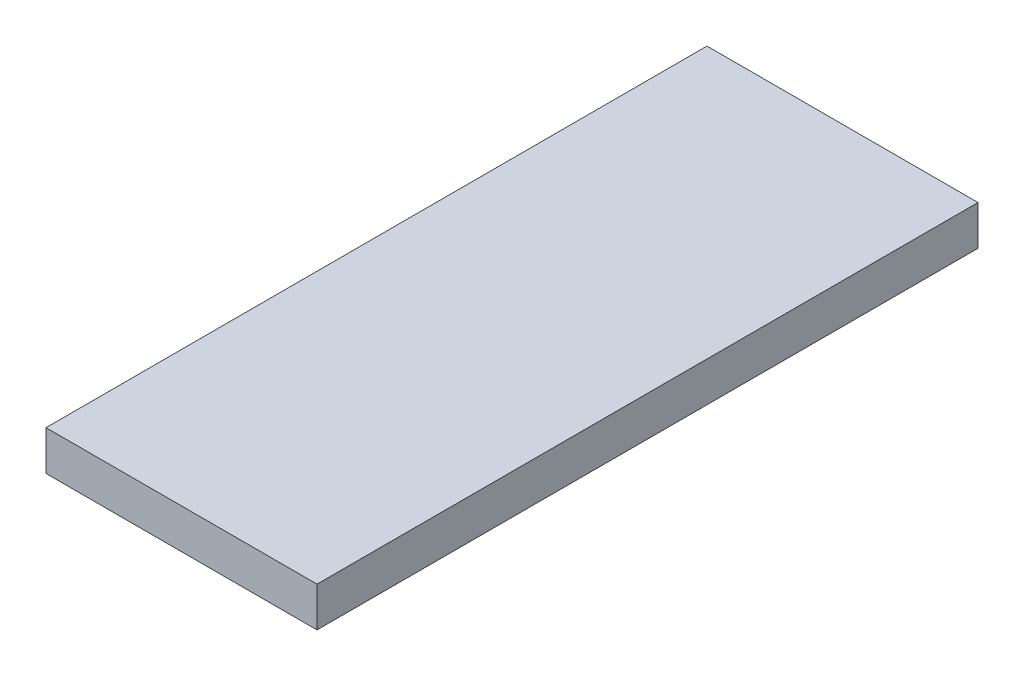
ISO-10303-21;
HEADER;
FILE_DESCRIPTION(('STEP AP214'),'2;1');
FILE_NAME('part.step','',(''),(''),'','','');
FILE_SCHEMA(('AUTOMOTIVE_DESIGN { 1 0 10303 214 1 1 1 1 }'));
ENDSEC;
DATA;
#1=APPLICATION_CONTEXT('core data for automotive mechanical design processes');
#2=APPLICATION_PROTOCOL_DEFINITION('international standard','automotive_design',2000,#1);
#3=PRODUCT_CONTEXT('',#1,'mechanical');
#4=PRODUCT('Part','Part','',(#3));
#5=PRODUCT_RELATED_PRODUCT_CATEGORY('part','',(#4));
#6=PRODUCT_DEFINITION_FORMATION('','',#4);
#7=PRODUCT_DEFINITION_CONTEXT('part definition',#1,'design');
#8=PRODUCT_DEFINITION('design','',#6,#7);
#9=PRODUCT_DEFINITION_SHAPE('','',#8);
#10=(LENGTH_UNIT() NAMED_UNIT(*) SI_UNIT(.MILLI.,.METRE.));
#11=(NAMED_UNIT(*) PLANE_ANGLE_UNIT() SI_UNIT($,.RADIAN.));
#12=(NAMED_UNIT(*) SI_UNIT($,.STERADIAN.) SOLID_ANGLE_UNIT());
#13=UNCERTAINTY_MEASURE_WITH_UNIT(LENGTH_MEASURE(1.E-05),#10,'distance_accuracy_value','');
#14=(GEOMETRIC_REPRESENTATION_CONTEXT(3) GLOBAL_UNCERTAINTY_ASSIGNED_CONTEXT((#13)) GLOBAL_UNIT_ASSIGNED_CONTEXT((#10,
#11,#12)) REPRESENTATION_CONTEXT('',''));
#15=CARTESIAN_POINT('',(0.,0.,0.));
#16=DIRECTION('',(0.,0.,1.));
#17=DIRECTION('',(1.,0.,0.));
#18=AXIS2_PLACEMENT_3D('',#15,#16,#17);
#19=CARTESIAN_POINT('',(-4.1,-0.600000000000001,20.));
#20=DIRECTION('',(1.,0.,0.));
#21=DIRECTION('',(0.,0.,-1.));
#22=AXIS2_PLACEMENT_3D('',#19,#20,#21);
#23=PLANE('',#22);
#24=DIRECTION('',(0.,-1.,0.));
#25=VECTOR('',#24,1.);
#26=CARTESIAN_POINT('',(-4.1,-0.600000000000001,0.));
#27=LINE('',#26,#25);
#28=CARTESIAN_POINT('',(-4.1,0.599999999999999,0.));
#29=VERTEX_POINT('',#28);
#30=CARTESIAN_POINT('',(-4.1,-0.600000000000001,0.));
#31=VERTEX_POINT('',#30);
#32=EDGE_CURVE('E95',#29,#31,#27,.T.);
#33=ORIENTED_EDGE('',*,*,#32,.T.);
#34=DIRECTION('',(0.,0.,-1.));
#35=VECTOR('',#34,1.);
#36=CARTESIAN_POINT('',(-4.1,-0.600000000000001,20.));
#37=LINE('',#36,#35);
#38=CARTESIAN_POINT('',(-4.1,-0.600000000000001,20.));
#39=VERTEX_POINT('',#38);
#40=EDGE_CURVE('E11',#39,#31,#37,.T.);
#41=ORIENTED_EDGE('',*,*,#40,.F.);
#42=DIRECTION('',(0.,-1.,0.));
#43=VECTOR('',#42,1.);
#44=CARTESIAN_POINT('',(-4.1,-0.600000000000001,20.));
#45=LINE('',#44,#43);
#46=CARTESIAN_POINT('',(-4.1,0.599999999999999,20.));
#47=VERTEX_POINT('',#46);
#48=EDGE_CURVE('E83',#47,#39,#45,.T.);
#49=ORIENTED_EDGE('',*,*,#48,.F.);
#50=DIRECTION('',(0.,0.,-1.));
#51=VECTOR('',#50,1.);
#52=CARTESIAN_POINT('',(-4.1,0.599999999999999,20.));
#53=LINE('',#52,#51);
#54=EDGE_CURVE('E91',#47,#29,#53,.T.);
#55=ORIENTED_EDGE('',*,*,#54,.T.);
#56=EDGE_LOOP('',(#33,#41,#49,#55));
#57=FACE_BOUND('',#56,.T.);
#58=ADVANCED_FACE('F32',(#57),#23,.F.);
#59=CARTESIAN_POINT('',(4.1,-0.599999999999999,20.));
#60=DIRECTION('',(0.,1.,0.));
#61=DIRECTION('',(-1.,0.,0.));
#62=AXIS2_PLACEMENT_3D('',#59,#60,#61);
#63=PLANE('',#62);
#64=DIRECTION('',(1.,0.,0.));
#65=VECTOR('',#64,1.);
#66=CARTESIAN_POINT('',(4.1,-0.599999999999999,0.));
#67=LINE('',#66,#65);
#68=CARTESIAN_POINT('',(4.1,-0.599999999999999,0.));
#69=VERTEX_POINT('',#68);
#70=EDGE_CURVE('E87',#31,#69,#67,.T.);
#71=ORIENTED_EDGE('',*,*,#70,.T.);
#72=DIRECTION('',(0.,0.,-1.));
#73=VECTOR('',#72,1.);
#74=CARTESIAN_POINT('',(4.1,-0.599999999999999,20.));
#75=LINE('',#74,#73);
#76=CARTESIAN_POINT('',(4.1,-0.599999999999999,20.));
#77=VERTEX_POINT('',#76);
#78=EDGE_CURVE('E40',#77,#69,#75,.T.);
#79=ORIENTED_EDGE('',*,*,#78,.F.);
#80=DIRECTION('',(1.,0.,0.));
#81=VECTOR('',#80,1.);
#82=CARTESIAN_POINT('',(4.1,-0.599999999999999,20.));
#83=LINE('',#82,#81);
#84=EDGE_CURVE('E78',#39,#77,#83,.T.);
#85=ORIENTED_EDGE('',*,*,#84,.F.);
#86=ORIENTED_EDGE('',*,*,#40,.T.);
#87=EDGE_LOOP('',(#71,#79,#85,#86));
#88=FACE_BOUND('',#87,.T.);
#89=ADVANCED_FACE('F86',(#88),#63,.F.);
#90=CARTESIAN_POINT('',(4.1,-0.599999999999999,20.));
#91=DIRECTION('',(-1.,0.,0.));
#92=DIRECTION('',(0.,0.,1.));
#93=AXIS2_PLACEMENT_3D('',#90,#91,#92);
#94=PLANE('',#93);
#95=DIRECTION('',(0.,1.,0.));
#96=VECTOR('',#95,1.);
#97=CARTESIAN_POINT('',(4.1,-0.599999999999999,0.));
#98=LINE('',#97,#96);
#99=CARTESIAN_POINT('',(4.1,0.6,0.));
#100=VERTEX_POINT('',#99);
#101=EDGE_CURVE('E65',#69,#100,#98,.T.);
#102=ORIENTED_EDGE('',*,*,#101,.T.);
#103=DIRECTION('',(0.,0.,-1.));
#104=VECTOR('',#103,1.);
#105=CARTESIAN_POINT('',(4.1,0.6,20.));
#106=LINE('',#105,#104);
#107=CARTESIAN_POINT('',(4.1,0.6,20.));
#108=VERTEX_POINT('',#107);
#109=EDGE_CURVE('E88',#108,#100,#106,.T.);
#110=ORIENTED_EDGE('',*,*,#109,.F.);
#111=DIRECTION('',(0.,1.,0.));
#112=VECTOR('',#111,1.);
#113=CARTESIAN_POINT('',(4.1,-0.599999999999999,20.));
#114=LINE('',#113,#112);
#115=EDGE_CURVE('E81',#77,#108,#114,.T.);
#116=ORIENTED_EDGE('',*,*,#115,.F.);
#117=ORIENTED_EDGE('',*,*,#78,.T.);
#118=EDGE_LOOP('',(#102,#110,#116,#117));
#119=FACE_BOUND('',#118,.T.);
#120=ADVANCED_FACE('F89',(#119),#94,.F.);
#121=CARTESIAN_POINT('',(4.1,0.6,20.));
#122=DIRECTION('',(0.,-1.,0.));
#123=DIRECTION('',(1.,0.,0.));
#124=AXIS2_PLACEMENT_3D('',#121,#122,#123);
#125=PLANE('',#124);
#126=DIRECTION('',(-1.,0.,0.));
#127=VECTOR('',#126,1.);
#128=CARTESIAN_POINT('',(4.1,0.6,0.));
#129=LINE('',#128,#127);
#130=EDGE_CURVE('E71',#100,#29,#129,.T.);
#131=ORIENTED_EDGE('',*,*,#130,.T.);
#132=ORIENTED_EDGE('',*,*,#54,.F.);
#133=DIRECTION('',(-1.,0.,0.));
#134=VECTOR('',#133,1.);
#135=CARTESIAN_POINT('',(4.1,0.6,20.));
#136=LINE('',#135,#134);
#137=EDGE_CURVE('E48',#108,#47,#136,.T.);
#138=ORIENTED_EDGE('',*,*,#137,.F.);
#139=ORIENTED_EDGE('',*,*,#109,.T.);
#140=EDGE_LOOP('',(#131,#132,#138,#139));
#141=FACE_BOUND('',#140,.T.);
#142=ADVANCED_FACE('F102',(#141),#125,.F.);
#143=CARTESIAN_POINT('',(0.,0.,20.));
#144=DIRECTION('',(0.,0.,1.));
#145=DIRECTION('',(1.,0.,0.));
#146=AXIS2_PLACEMENT_3D('',#143,#144,#145);
#147=PLANE('',#146);
#148=ORIENTED_EDGE('',*,*,#48,.T.);
#149=ORIENTED_EDGE('',*,*,#84,.T.);
#150=ORIENTED_EDGE('',*,*,#115,.T.);
#151=ORIENTED_EDGE('',*,*,#137,.T.);
#152=EDGE_LOOP('',(#148,#149,#150,#151));
#153=FACE_BOUND('',#152,.T.);
#154=ADVANCED_FACE('F79',(#153),#147,.T.);
#155=CARTESIAN_POINT('',(0.,0.,0.));
#156=DIRECTION('',(0.,0.,1.));
#157=DIRECTION('',(1.,0.,0.));
#158=AXIS2_PLACEMENT_3D('',#155,#156,#157);
#159=PLANE('',#158);
#160=ORIENTED_EDGE('',*,*,#32,.F.);
#161=ORIENTED_EDGE('',*,*,#130,.F.);
#162=ORIENTED_EDGE('',*,*,#101,.F.);
#163=ORIENTED_EDGE('',*,*,#70,.F.);
#164=EDGE_LOOP('',(#160,#161,#162,#163));
#165=FACE_BOUND('',#164,.T.);
#166=ADVANCED_FACE('F105',(#165),#159,.F.);
#167=CLOSED_SHELL('',(#58,#89,#120,#142,#154,#166));
#168=MANIFOLD_SOLID_BREP('B2',#167);
#169=ADVANCED_BREP_SHAPE_REPRESENTATION('',(#18,#168),#14);
#170=SHAPE_DEFINITION_REPRESENTATION(#9,#169);
ENDSEC;
END-ISO-10303-21;
